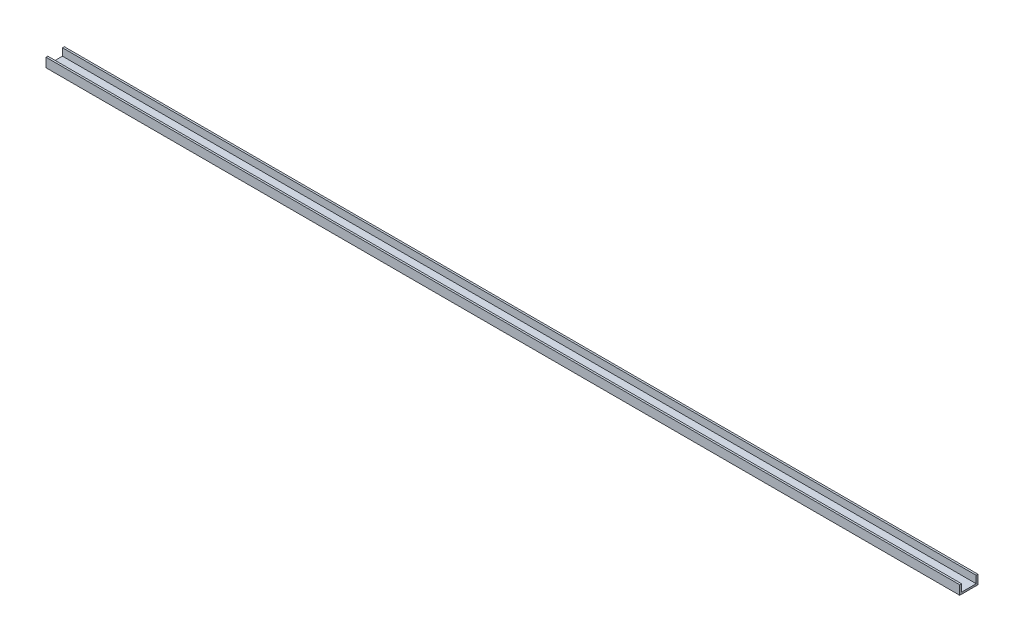
ISO-10303-21;
HEADER;
FILE_DESCRIPTION(('STEP AP214'),'2;1');
FILE_NAME('part.step','',(''),(''),'','','');
FILE_SCHEMA(('AUTOMOTIVE_DESIGN { 1 0 10303 214 1 1 1 1 }'));
ENDSEC;
DATA;
#1=APPLICATION_CONTEXT('core data for automotive mechanical design processes');
#2=APPLICATION_PROTOCOL_DEFINITION('international standard','automotive_design',2000,#1);
#3=PRODUCT_CONTEXT('',#1,'mechanical');
#4=PRODUCT('Part','Part','',(#3));
#5=PRODUCT_RELATED_PRODUCT_CATEGORY('part','',(#4));
#6=PRODUCT_DEFINITION_FORMATION('','',#4);
#7=PRODUCT_DEFINITION_CONTEXT('part definition',#1,'design');
#8=PRODUCT_DEFINITION('design','',#6,#7);
#9=PRODUCT_DEFINITION_SHAPE('','',#8);
#10=(LENGTH_UNIT() NAMED_UNIT(*) SI_UNIT(.MILLI.,.METRE.));
#11=(NAMED_UNIT(*) PLANE_ANGLE_UNIT() SI_UNIT($,.RADIAN.));
#12=(NAMED_UNIT(*) SI_UNIT($,.STERADIAN.) SOLID_ANGLE_UNIT());
#13=UNCERTAINTY_MEASURE_WITH_UNIT(LENGTH_MEASURE(1.E-05),#10,'distance_accuracy_value','');
#14=(GEOMETRIC_REPRESENTATION_CONTEXT(3) GLOBAL_UNCERTAINTY_ASSIGNED_CONTEXT((#13)) GLOBAL_UNIT_ASSIGNED_CONTEXT((#10,
#11,#12)) REPRESENTATION_CONTEXT('',''));
#15=CARTESIAN_POINT('',(0.,0.,0.));
#16=DIRECTION('',(0.,0.,1.));
#17=DIRECTION('',(1.,0.,0.));
#18=AXIS2_PLACEMENT_3D('',#15,#16,#17);
#19=CARTESIAN_POINT('',(1000.,10.,-2.));
#20=DIRECTION('',(0.,-1.,0.));
#21=DIRECTION('',(0.,0.,-1.));
#22=AXIS2_PLACEMENT_3D('',#19,#20,#21);
#23=PLANE('',#22);
#24=DIRECTION('',(0.,0.,1.));
#25=VECTOR('',#24,1.);
#26=CARTESIAN_POINT('',(0.,10.,-2.));
#27=LINE('',#26,#25);
#28=CARTESIAN_POINT('',(0.,10.,-2.));
#29=VERTEX_POINT('',#28);
#30=CARTESIAN_POINT('',(0.,10.,0.));
#31=VERTEX_POINT('',#30);
#32=EDGE_CURVE('E129',#29,#31,#27,.T.);
#33=ORIENTED_EDGE('',*,*,#32,.T.);
#34=DIRECTION('',(-1.,0.,0.));
#35=VECTOR('',#34,1.);
#36=CARTESIAN_POINT('',(1000.,10.,0.));
#37=LINE('',#36,#35);
#38=CARTESIAN_POINT('',(1000.,10.,0.));
#39=VERTEX_POINT('',#38);
#40=EDGE_CURVE('E11',#39,#31,#37,.T.);
#41=ORIENTED_EDGE('',*,*,#40,.F.);
#42=DIRECTION('',(0.,0.,1.));
#43=VECTOR('',#42,1.);
#44=CARTESIAN_POINT('',(1000.,10.,-2.));
#45=LINE('',#44,#43);
#46=CARTESIAN_POINT('',(1000.,10.,-2.));
#47=VERTEX_POINT('',#46);
#48=EDGE_CURVE('E143',#47,#39,#45,.T.);
#49=ORIENTED_EDGE('',*,*,#48,.F.);
#50=DIRECTION('',(-1.,0.,0.));
#51=VECTOR('',#50,1.);
#52=CARTESIAN_POINT('',(1000.,10.,-2.));
#53=LINE('',#52,#51);
#54=EDGE_CURVE('E125',#47,#29,#53,.T.);
#55=ORIENTED_EDGE('',*,*,#54,.T.);
#56=EDGE_LOOP('',(#33,#41,#49,#55));
#57=FACE_BOUND('',#56,.T.);
#58=ADVANCED_FACE('F33',(#57),#23,.F.);
#59=CARTESIAN_POINT('',(1000.,10.,0.));
#60=DIRECTION('',(0.,0.,-1.));
#61=DIRECTION('',(0.,1.,0.));
#62=AXIS2_PLACEMENT_3D('',#59,#60,#61);
#63=PLANE('',#62);
#64=DIRECTION('',(0.,-1.,0.));
#65=VECTOR('',#64,1.);
#66=CARTESIAN_POINT('',(0.,10.,0.));
#67=LINE('',#66,#65);
#68=CARTESIAN_POINT('',(0.,0.,0.));
#69=VERTEX_POINT('',#68);
#70=EDGE_CURVE('E132',#31,#69,#67,.T.);
#71=ORIENTED_EDGE('',*,*,#70,.T.);
#72=DIRECTION('',(-1.,0.,0.));
#73=VECTOR('',#72,1.);
#74=CARTESIAN_POINT('',(1000.,0.,0.));
#75=LINE('',#74,#73);
#76=CARTESIAN_POINT('',(1000.,0.,0.));
#77=VERTEX_POINT('',#76);
#78=EDGE_CURVE('E41',#77,#69,#75,.T.);
#79=ORIENTED_EDGE('',*,*,#78,.F.);
#80=DIRECTION('',(0.,-1.,0.));
#81=VECTOR('',#80,1.);
#82=CARTESIAN_POINT('',(1000.,10.,0.));
#83=LINE('',#82,#81);
#84=EDGE_CURVE('E92',#39,#77,#83,.T.);
#85=ORIENTED_EDGE('',*,*,#84,.F.);
#86=ORIENTED_EDGE('',*,*,#40,.T.);
#87=EDGE_LOOP('',(#71,#79,#85,#86));
#88=FACE_BOUND('',#87,.T.);
#89=ADVANCED_FACE('F178',(#88),#63,.F.);
#90=CARTESIAN_POINT('',(1000.,0.,0.));
#91=DIRECTION('',(0.,1.,0.));
#92=DIRECTION('',(0.,0.,1.));
#93=AXIS2_PLACEMENT_3D('',#90,#91,#92);
#94=PLANE('',#93);
#95=DIRECTION('',(0.,0.,-1.));
#96=VECTOR('',#95,1.);
#97=CARTESIAN_POINT('',(0.,0.,0.));
#98=LINE('',#97,#96);
#99=CARTESIAN_POINT('',(0.,0.,-20.));
#100=VERTEX_POINT('',#99);
#101=EDGE_CURVE('E134',#69,#100,#98,.T.);
#102=ORIENTED_EDGE('',*,*,#101,.T.);
#103=DIRECTION('',(-1.,0.,0.));
#104=VECTOR('',#103,1.);
#105=CARTESIAN_POINT('',(1000.,0.,-20.));
#106=LINE('',#105,#104);
#107=CARTESIAN_POINT('',(1000.,0.,-20.));
#108=VERTEX_POINT('',#107);
#109=EDGE_CURVE('E150',#108,#100,#106,.T.);
#110=ORIENTED_EDGE('',*,*,#109,.F.);
#111=DIRECTION('',(0.,0.,-1.));
#112=VECTOR('',#111,1.);
#113=CARTESIAN_POINT('',(1000.,0.,0.));
#114=LINE('',#113,#112);
#115=EDGE_CURVE('E158',#77,#108,#114,.T.);
#116=ORIENTED_EDGE('',*,*,#115,.F.);
#117=ORIENTED_EDGE('',*,*,#78,.T.);
#118=EDGE_LOOP('',(#102,#110,#116,#117));
#119=FACE_BOUND('',#118,.T.);
#120=ADVANCED_FACE('F156',(#119),#94,.F.);
#121=CARTESIAN_POINT('',(1000.,0.,-20.));
#122=DIRECTION('',(0.,0.,1.));
#123=DIRECTION('',(1.,0.,0.));
#124=AXIS2_PLACEMENT_3D('',#121,#122,#123);
#125=PLANE('',#124);
#126=DIRECTION('',(0.,1.,0.));
#127=VECTOR('',#126,1.);
#128=CARTESIAN_POINT('',(0.,0.,-20.));
#129=LINE('',#128,#127);
#130=CARTESIAN_POINT('',(0.,10.,-20.));
#131=VERTEX_POINT('',#130);
#132=EDGE_CURVE('E136',#100,#131,#129,.T.);
#133=ORIENTED_EDGE('',*,*,#132,.T.);
#134=DIRECTION('',(-1.,0.,0.));
#135=VECTOR('',#134,1.);
#136=CARTESIAN_POINT('',(1000.,10.,-20.));
#137=LINE('',#136,#135);
#138=CARTESIAN_POINT('',(1000.,10.,-20.));
#139=VERTEX_POINT('',#138);
#140=EDGE_CURVE('E147',#139,#131,#137,.T.);
#141=ORIENTED_EDGE('',*,*,#140,.F.);
#142=DIRECTION('',(0.,1.,0.));
#143=VECTOR('',#142,1.);
#144=CARTESIAN_POINT('',(1000.,0.,-20.));
#145=LINE('',#144,#143);
#146=EDGE_CURVE('E170',#108,#139,#145,.T.);
#147=ORIENTED_EDGE('',*,*,#146,.F.);
#148=ORIENTED_EDGE('',*,*,#109,.T.);
#149=EDGE_LOOP('',(#133,#141,#147,#148));
#150=FACE_BOUND('',#149,.T.);
#151=ADVANCED_FACE('F166',(#150),#125,.F.);
#152=CARTESIAN_POINT('',(1000.,10.,-20.));
#153=DIRECTION('',(0.,-1.,0.));
#154=DIRECTION('',(0.,0.,-1.));
#155=AXIS2_PLACEMENT_3D('',#152,#153,#154);
#156=PLANE('',#155);
#157=DIRECTION('',(0.,0.,1.));
#158=VECTOR('',#157,1.);
#159=CARTESIAN_POINT('',(0.,10.,-20.));
#160=LINE('',#159,#158);
#161=CARTESIAN_POINT('',(0.,10.,-18.));
#162=VERTEX_POINT('',#161);
#163=EDGE_CURVE('E138',#131,#162,#160,.T.);
#164=ORIENTED_EDGE('',*,*,#163,.T.);
#165=DIRECTION('',(-1.,0.,0.));
#166=VECTOR('',#165,1.);
#167=CARTESIAN_POINT('',(1000.,10.,-18.));
#168=LINE('',#167,#166);
#169=CARTESIAN_POINT('',(1000.,10.,-18.));
#170=VERTEX_POINT('',#169);
#171=EDGE_CURVE('E120',#170,#162,#168,.T.);
#172=ORIENTED_EDGE('',*,*,#171,.F.);
#173=DIRECTION('',(0.,0.,1.));
#174=VECTOR('',#173,1.);
#175=CARTESIAN_POINT('',(1000.,10.,-20.));
#176=LINE('',#175,#174);
#177=EDGE_CURVE('E111',#139,#170,#176,.T.);
#178=ORIENTED_EDGE('',*,*,#177,.F.);
#179=ORIENTED_EDGE('',*,*,#140,.T.);
#180=EDGE_LOOP('',(#164,#172,#178,#179));
#181=FACE_BOUND('',#180,.T.);
#182=ADVANCED_FACE('F169',(#181),#156,.F.);
#183=CARTESIAN_POINT('',(1000.,10.,-18.));
#184=DIRECTION('',(0.,0.,-1.));
#185=DIRECTION('',(-1.,0.,0.));
#186=AXIS2_PLACEMENT_3D('',#183,#184,#185);
#187=PLANE('',#186);
#188=DIRECTION('',(0.,-1.,0.));
#189=VECTOR('',#188,1.);
#190=CARTESIAN_POINT('',(0.,10.,-18.));
#191=LINE('',#190,#189);
#192=CARTESIAN_POINT('',(0.,2.,-18.));
#193=VERTEX_POINT('',#192);
#194=EDGE_CURVE('E119',#162,#193,#191,.T.);
#195=ORIENTED_EDGE('',*,*,#194,.T.);
#196=DIRECTION('',(-1.,0.,0.));
#197=VECTOR('',#196,1.);
#198=CARTESIAN_POINT('',(1000.,2.,-18.));
#199=LINE('',#198,#197);
#200=CARTESIAN_POINT('',(1000.,2.,-18.));
#201=VERTEX_POINT('',#200);
#202=EDGE_CURVE('E116',#201,#193,#199,.T.);
#203=ORIENTED_EDGE('',*,*,#202,.F.);
#204=DIRECTION('',(0.,-1.,0.));
#205=VECTOR('',#204,1.);
#206=CARTESIAN_POINT('',(1000.,10.,-18.));
#207=LINE('',#206,#205);
#208=EDGE_CURVE('E105',#170,#201,#207,.T.);
#209=ORIENTED_EDGE('',*,*,#208,.F.);
#210=ORIENTED_EDGE('',*,*,#171,.T.);
#211=EDGE_LOOP('',(#195,#203,#209,#210));
#212=FACE_BOUND('',#211,.T.);
#213=ADVANCED_FACE('F117',(#212),#187,.F.);
#214=CARTESIAN_POINT('',(1000.,2.,-18.));
#215=DIRECTION('',(0.,-1.,0.));
#216=DIRECTION('',(0.,0.,-1.));
#217=AXIS2_PLACEMENT_3D('',#214,#215,#216);
#218=PLANE('',#217);
#219=DIRECTION('',(0.,0.,1.));
#220=VECTOR('',#219,1.);
#221=CARTESIAN_POINT('',(0.,2.,-18.));
#222=LINE('',#221,#220);
#223=CARTESIAN_POINT('',(0.,2.,-2.));
#224=VERTEX_POINT('',#223);
#225=EDGE_CURVE('E78',#193,#224,#222,.T.);
#226=ORIENTED_EDGE('',*,*,#225,.T.);
#227=DIRECTION('',(-1.,0.,0.));
#228=VECTOR('',#227,1.);
#229=CARTESIAN_POINT('',(1000.,2.,-2.));
#230=LINE('',#229,#228);
#231=CARTESIAN_POINT('',(1000.,2.,-2.));
#232=VERTEX_POINT('',#231);
#233=EDGE_CURVE('E121',#232,#224,#230,.T.);
#234=ORIENTED_EDGE('',*,*,#233,.F.);
#235=DIRECTION('',(0.,0.,1.));
#236=VECTOR('',#235,1.);
#237=CARTESIAN_POINT('',(1000.,2.,-18.));
#238=LINE('',#237,#236);
#239=EDGE_CURVE('E109',#201,#232,#238,.T.);
#240=ORIENTED_EDGE('',*,*,#239,.F.);
#241=ORIENTED_EDGE('',*,*,#202,.T.);
#242=EDGE_LOOP('',(#226,#234,#240,#241));
#243=FACE_BOUND('',#242,.T.);
#244=ADVANCED_FACE('F123',(#243),#218,.F.);
#245=CARTESIAN_POINT('',(1000.,2.,-2.));
#246=DIRECTION('',(0.,0.,1.));
#247=DIRECTION('',(1.,0.,0.));
#248=AXIS2_PLACEMENT_3D('',#245,#246,#247);
#249=PLANE('',#248);
#250=DIRECTION('',(0.,1.,0.));
#251=VECTOR('',#250,1.);
#252=CARTESIAN_POINT('',(0.,2.,-2.));
#253=LINE('',#252,#251);
#254=EDGE_CURVE('E84',#224,#29,#253,.T.);
#255=ORIENTED_EDGE('',*,*,#254,.T.);
#256=ORIENTED_EDGE('',*,*,#54,.F.);
#257=DIRECTION('',(0.,1.,0.));
#258=VECTOR('',#257,1.);
#259=CARTESIAN_POINT('',(1000.,2.,-2.));
#260=LINE('',#259,#258);
#261=EDGE_CURVE('E49',#232,#47,#260,.T.);
#262=ORIENTED_EDGE('',*,*,#261,.F.);
#263=ORIENTED_EDGE('',*,*,#233,.T.);
#264=EDGE_LOOP('',(#255,#256,#262,#263));
#265=FACE_BOUND('',#264,.T.);
#266=ADVANCED_FACE('F194',(#265),#249,.F.);
#267=CARTESIAN_POINT('',(1000.,0.,0.));
#268=DIRECTION('',(1.,0.,0.));
#269=DIRECTION('',(0.,0.,-1.));
#270=AXIS2_PLACEMENT_3D('',#267,#268,#269);
#271=PLANE('',#270);
#272=ORIENTED_EDGE('',*,*,#48,.T.);
#273=ORIENTED_EDGE('',*,*,#84,.T.);
#274=ORIENTED_EDGE('',*,*,#115,.T.);
#275=ORIENTED_EDGE('',*,*,#146,.T.);
#276=ORIENTED_EDGE('',*,*,#177,.T.);
#277=ORIENTED_EDGE('',*,*,#208,.T.);
#278=ORIENTED_EDGE('',*,*,#239,.T.);
#279=ORIENTED_EDGE('',*,*,#261,.T.);
#280=EDGE_LOOP('',(#272,#273,#274,#275,#276,#277,#278,#279));
#281=FACE_BOUND('',#280,.T.);
#282=ADVANCED_FACE('F107',(#281),#271,.T.);
#283=CARTESIAN_POINT('',(0.,0.,0.));
#284=DIRECTION('',(1.,0.,0.));
#285=DIRECTION('',(0.,0.,-1.));
#286=AXIS2_PLACEMENT_3D('',#283,#284,#285);
#287=PLANE('',#286);
#288=ORIENTED_EDGE('',*,*,#32,.F.);
#289=ORIENTED_EDGE('',*,*,#254,.F.);
#290=ORIENTED_EDGE('',*,*,#225,.F.);
#291=ORIENTED_EDGE('',*,*,#194,.F.);
#292=ORIENTED_EDGE('',*,*,#163,.F.);
#293=ORIENTED_EDGE('',*,*,#132,.F.);
#294=ORIENTED_EDGE('',*,*,#101,.F.);
#295=ORIENTED_EDGE('',*,*,#70,.F.);
#296=EDGE_LOOP('',(#288,#289,#290,#291,#292,#293,#294,#295));
#297=FACE_BOUND('',#296,.T.);
#298=ADVANCED_FACE('F162',(#297),#287,.F.);
#299=CLOSED_SHELL('',(#58,#89,#120,#151,#182,#213,#244,#266,#282,#298));
#300=MANIFOLD_SOLID_BREP('B2',#299);
#301=ADVANCED_BREP_SHAPE_REPRESENTATION('',(#18,#300),#14);
#302=SHAPE_DEFINITION_REPRESENTATION(#9,#301);
ENDSEC;
END-ISO-10303-21;
